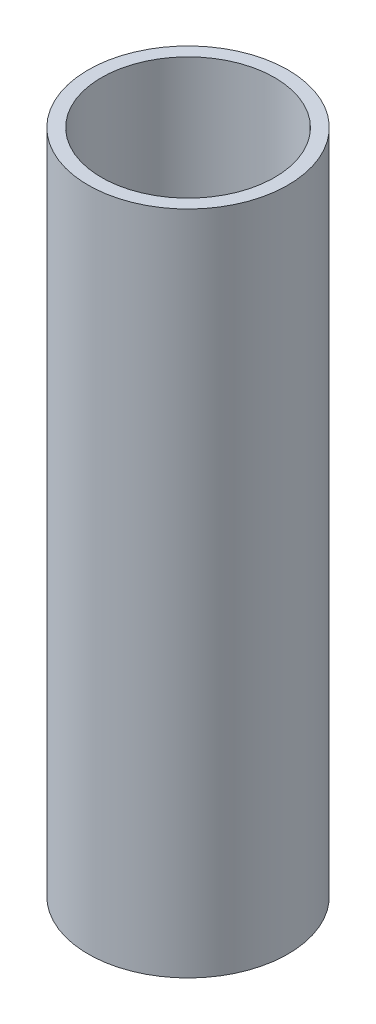
ISO-10303-21;
HEADER;
FILE_DESCRIPTION(('STEP AP214'),'2;1');
FILE_NAME('part.step','',(''),(''),'','','');
FILE_SCHEMA(('AUTOMOTIVE_DESIGN { 1 0 10303 214 1 1 1 1 }'));
ENDSEC;
DATA;
#1=APPLICATION_CONTEXT('core data for automotive mechanical design processes');
#2=APPLICATION_PROTOCOL_DEFINITION('international standard','automotive_design',2000,#1);
#3=PRODUCT_CONTEXT('',#1,'mechanical');
#4=PRODUCT('Part','Part','',(#3));
#5=PRODUCT_RELATED_PRODUCT_CATEGORY('part','',(#4));
#6=PRODUCT_DEFINITION_FORMATION('','',#4);
#7=PRODUCT_DEFINITION_CONTEXT('part definition',#1,'design');
#8=PRODUCT_DEFINITION('design','',#6,#7);
#9=PRODUCT_DEFINITION_SHAPE('','',#8);
#10=(LENGTH_UNIT() NAMED_UNIT(*) SI_UNIT(.MILLI.,.METRE.));
#11=(NAMED_UNIT(*) PLANE_ANGLE_UNIT() SI_UNIT($,.RADIAN.));
#12=(NAMED_UNIT(*) SI_UNIT($,.STERADIAN.) SOLID_ANGLE_UNIT());
#13=UNCERTAINTY_MEASURE_WITH_UNIT(LENGTH_MEASURE(1.E-05),#10,'distance_accuracy_value','');
#14=(GEOMETRIC_REPRESENTATION_CONTEXT(3) GLOBAL_UNCERTAINTY_ASSIGNED_CONTEXT((#13)) GLOBAL_UNIT_ASSIGNED_CONTEXT((#10,
#11,#12)) REPRESENTATION_CONTEXT('',''));
#15=CARTESIAN_POINT('',(0.,0.,0.));
#16=DIRECTION('',(0.,0.,1.));
#17=DIRECTION('',(1.,0.,0.));
#18=AXIS2_PLACEMENT_3D('',#15,#16,#17);
#19=CARTESIAN_POINT('',(0.,0.,0.));
#20=DIRECTION('',(0.,-1.,0.));
#21=DIRECTION('',(0.,0.,-1.));
#22=AXIS2_PLACEMENT_3D('',#19,#20,#21);
#23=PLANE('',#22);
#24=CARTESIAN_POINT('',(0.,0.,0.));
#25=DIRECTION('',(0.,1.,0.));
#26=DIRECTION('',(0.,0.,1.));
#27=AXIS2_PLACEMENT_3D('',#24,#25,#26);
#28=CIRCLE('',#27,13.);
#29=CARTESIAN_POINT('',(0.,0.,-13.));
#30=VERTEX_POINT('',#29);
#31=EDGE_CURVE('E167',#30,#30,#28,.T.);
#32=ORIENTED_EDGE('',*,*,#31,.T.);
#33=EDGE_LOOP('',(#32));
#34=FACE_BOUND('',#33,.T.);
#35=DIRECTION('',(-0.5,0.,-0.866025403784439));
#36=VECTOR('',#35,1.);
#37=CARTESIAN_POINT('',(5.77350269189626,0.,0.));
#38=LINE('',#37,#36);
#39=CARTESIAN_POINT('',(5.77350269189626,0.,0.));
#40=VERTEX_POINT('',#39);
#41=CARTESIAN_POINT('',(2.88675134594813,0.,-5.));
#42=VERTEX_POINT('',#41);
#43=EDGE_CURVE('E132',#40,#42,#38,.T.);
#44=ORIENTED_EDGE('',*,*,#43,.F.);
#45=DIRECTION('',(0.5,0.,-0.866025403784439));
#46=VECTOR('',#45,1.);
#47=CARTESIAN_POINT('',(2.88675134594813,0.,5.));
#48=LINE('',#47,#46);
#49=CARTESIAN_POINT('',(2.88675134594813,0.,5.));
#50=VERTEX_POINT('',#49);
#51=EDGE_CURVE('E148',#50,#40,#48,.T.);
#52=ORIENTED_EDGE('',*,*,#51,.F.);
#53=DIRECTION('',(1.,0.,0.));
#54=VECTOR('',#53,1.);
#55=CARTESIAN_POINT('',(-2.88675134594813,0.,5.));
#56=LINE('',#55,#54);
#57=CARTESIAN_POINT('',(-2.88675134594813,0.,5.));
#58=VERTEX_POINT('',#57);
#59=EDGE_CURVE('E55',#58,#50,#56,.T.);
#60=ORIENTED_EDGE('',*,*,#59,.F.);
#61=DIRECTION('',(0.5,0.,0.866025403784438));
#62=VECTOR('',#61,1.);
#63=CARTESIAN_POINT('',(-5.77350269189626,0.,0.));
#64=LINE('',#63,#62);
#65=CARTESIAN_POINT('',(-5.77350269189626,0.,0.));
#66=VERTEX_POINT('',#65);
#67=EDGE_CURVE('E105',#66,#58,#64,.T.);
#68=ORIENTED_EDGE('',*,*,#67,.F.);
#69=DIRECTION('',(-0.5,0.,0.866025403784439));
#70=VECTOR('',#69,1.);
#71=CARTESIAN_POINT('',(-2.88675134594813,0.,-5.));
#72=LINE('',#71,#70);
#73=CARTESIAN_POINT('',(-2.88675134594813,0.,-5.));
#74=VERTEX_POINT('',#73);
#75=EDGE_CURVE('E140',#74,#66,#72,.T.);
#76=ORIENTED_EDGE('',*,*,#75,.F.);
#77=DIRECTION('',(-1.,0.,0.));
#78=VECTOR('',#77,1.);
#79=CARTESIAN_POINT('',(2.88675134594813,0.,-5.));
#80=LINE('',#79,#78);
#81=EDGE_CURVE('E135',#42,#74,#80,.T.);
#82=ORIENTED_EDGE('',*,*,#81,.F.);
#83=EDGE_LOOP('',(#44,#52,#60,#68,#76,#82));
#84=FACE_BOUND('',#83,.T.);
#85=ADVANCED_FACE('F39',(#34,#84),#23,.F.);
#86=CARTESIAN_POINT('',(0.,90.,0.));
#87=DIRECTION('',(0.,1.,0.));
#88=DIRECTION('',(0.,0.,1.));
#89=AXIS2_PLACEMENT_3D('',#86,#87,#88);
#90=PLANE('',#89);
#91=CARTESIAN_POINT('',(0.,90.,0.));
#92=DIRECTION('',(0.,1.,0.));
#93=DIRECTION('',(0.,0.,1.));
#94=AXIS2_PLACEMENT_3D('',#91,#92,#93);
#95=CIRCLE('',#94,15.);
#96=CARTESIAN_POINT('',(0.,90.,-15.));
#97=VERTEX_POINT('',#96);
#98=EDGE_CURVE('E11',#97,#97,#95,.T.);
#99=ORIENTED_EDGE('',*,*,#98,.T.);
#100=EDGE_LOOP('',(#99));
#101=FACE_BOUND('',#100,.T.);
#102=CARTESIAN_POINT('',(0.,90.,0.));
#103=DIRECTION('',(0.,1.,0.));
#104=DIRECTION('',(0.,0.,1.));
#105=AXIS2_PLACEMENT_3D('',#102,#103,#104);
#106=CIRCLE('',#105,13.);
#107=CARTESIAN_POINT('',(0.,90.,-13.));
#108=VERTEX_POINT('',#107);
#109=EDGE_CURVE('E48',#108,#108,#106,.T.);
#110=ORIENTED_EDGE('',*,*,#109,.F.);
#111=EDGE_LOOP('',(#110));
#112=FACE_BOUND('',#111,.T.);
#113=ADVANCED_FACE('F188',(#101,#112),#90,.T.);
#114=CARTESIAN_POINT('',(0.,90.,0.));
#115=DIRECTION('',(0.,-1.,0.));
#116=DIRECTION('',(0.,0.,-1.));
#117=AXIS2_PLACEMENT_3D('',#114,#115,#116);
#118=CYLINDRICAL_SURFACE('',#117,15.);
#119=CARTESIAN_POINT('',(0.,-10.,0.));
#120=DIRECTION('',(0.,-1.,0.));
#121=DIRECTION('',(0.,0.,-1.));
#122=AXIS2_PLACEMENT_3D('',#119,#120,#121);
#123=CIRCLE('',#122,15.);
#124=CARTESIAN_POINT('',(0.,-9.99999999999999,-15.));
#125=VERTEX_POINT('',#124);
#126=EDGE_CURVE('E154',#125,#125,#123,.T.);
#127=CARTESIAN_POINT('',(0.,90.,-15.));
#128=CARTESIAN_POINT('',(0.,88.9583333333333,-15.));
#129=CARTESIAN_POINT('',(0.,87.9166666666667,-15.));
#130=CARTESIAN_POINT('',(0.,85.8333333333333,-15.));
#131=CARTESIAN_POINT('',(0.,84.7916666666667,-15.));
#132=CARTESIAN_POINT('',(0.,82.7083333333333,-15.));
#133=CARTESIAN_POINT('',(0.,81.6666666666667,-15.));
#134=CARTESIAN_POINT('',(0.,79.5833333333333,-15.));
#135=CARTESIAN_POINT('',(0.,78.5416666666666,-15.));
#136=CARTESIAN_POINT('',(0.,76.4583333333333,-15.));
#137=CARTESIAN_POINT('',(0.,75.4166666666667,-15.));
#138=CARTESIAN_POINT('',(0.,73.3333333333333,-15.));
#139=CARTESIAN_POINT('',(0.,72.2916666666667,-15.));
#140=CARTESIAN_POINT('',(0.,70.2083333333333,-15.));
#141=CARTESIAN_POINT('',(0.,69.1666666666667,-15.));
#142=CARTESIAN_POINT('',(0.,67.0833333333333,-15.));
#143=CARTESIAN_POINT('',(0.,66.0416666666667,-15.));
#144=CARTESIAN_POINT('',(0.,63.9583333333333,-15.));
#145=CARTESIAN_POINT('',(0.,62.9166666666667,-15.));
#146=CARTESIAN_POINT('',(0.,60.8333333333333,-15.));
#147=CARTESIAN_POINT('',(0.,59.7916666666667,-15.));
#148=CARTESIAN_POINT('',(0.,57.7083333333333,-15.));
#149=CARTESIAN_POINT('',(0.,56.6666666666667,-15.));
#150=CARTESIAN_POINT('',(0.,54.5833333333333,-15.));
#151=CARTESIAN_POINT('',(0.,53.5416666666667,-15.));
#152=CARTESIAN_POINT('',(0.,51.4583333333333,-15.));
#153=CARTESIAN_POINT('',(0.,50.4166666666667,-15.));
#154=CARTESIAN_POINT('',(0.,48.3333333333333,-15.));
#155=CARTESIAN_POINT('',(0.,47.2916666666667,-15.));
#156=CARTESIAN_POINT('',(0.,45.2083333333333,-15.));
#157=CARTESIAN_POINT('',(0.,44.1666666666667,-15.));
#158=CARTESIAN_POINT('',(0.,42.0833333333333,-15.));
#159=CARTESIAN_POINT('',(0.,41.0416666666667,-15.));
#160=CARTESIAN_POINT('',(0.,38.9583333333333,-15.));
#161=CARTESIAN_POINT('',(0.,37.9166666666667,-15.));
#162=CARTESIAN_POINT('',(0.,35.8333333333333,-15.));
#163=CARTESIAN_POINT('',(0.,34.7916666666667,-15.));
#164=CARTESIAN_POINT('',(0.,32.7083333333333,-15.));
#165=CARTESIAN_POINT('',(0.,31.6666666666667,-15.));
#166=CARTESIAN_POINT('',(0.,29.5833333333333,-15.));
#167=CARTESIAN_POINT('',(0.,28.5416666666667,-15.));
#168=CARTESIAN_POINT('',(0.,26.4583333333333,-15.));
#169=CARTESIAN_POINT('',(0.,25.4166666666667,-15.));
#170=CARTESIAN_POINT('',(0.,23.3333333333333,-15.));
#171=CARTESIAN_POINT('',(0.,22.2916666666667,-15.));
#172=CARTESIAN_POINT('',(0.,20.2083333333333,-15.));
#173=CARTESIAN_POINT('',(0.,19.1666666666667,-15.));
#174=CARTESIAN_POINT('',(0.,17.0833333333333,-15.));
#175=CARTESIAN_POINT('',(0.,16.0416666666667,-15.));
#176=CARTESIAN_POINT('',(0.,13.9583333333333,-15.));
#177=CARTESIAN_POINT('',(0.,12.9166666666667,-15.));
#178=CARTESIAN_POINT('',(0.,10.8333333333333,-15.));
#179=CARTESIAN_POINT('',(0.,9.79166666666667,-15.));
#180=CARTESIAN_POINT('',(0.,7.70833333333334,-15.));
#181=CARTESIAN_POINT('',(0.,6.66666666666667,-15.));
#182=CARTESIAN_POINT('',(0.,4.58333333333334,-15.));
#183=CARTESIAN_POINT('',(0.,3.54166666666667,-15.));
#184=CARTESIAN_POINT('',(0.,1.45833333333333,-15.));
#185=CARTESIAN_POINT('',(0.,0.416666666666667,-15.));
#186=CARTESIAN_POINT('',(0.,-1.66666666666666,-15.));
#187=CARTESIAN_POINT('',(0.,-2.70833333333333,-15.));
#188=CARTESIAN_POINT('',(0.,-4.79166666666666,-15.));
#189=CARTESIAN_POINT('',(0.,-5.83333333333333,-15.));
#190=CARTESIAN_POINT('',(0.,-7.91666666666666,-15.));
#191=CARTESIAN_POINT('',(0.,-8.95833333333333,-15.));
#192=CARTESIAN_POINT('',(0.,-9.99999999999999,-15.));
#193=B_SPLINE_CURVE_WITH_KNOTS('',3,(#127,#128,#129,#130,#131,#132,#133,#134,#135,#136,#137,
#138,#139,#140,#141,#142,#143,#144,#145,#146,#147,#148,#149,#150,#151,#152,#153,#154,#155,#156,
#157,#158,#159,#160,#161,#162,#163,#164,#165,#166,#167,#168,#169,#170,#171,#172,#173,#174,#175,
#176,#177,#178,#179,#180,#181,#182,#183,#184,#185,#186,#187,#188,#189,#190,#191,#192),
.UNSPECIFIED.,.F.,.F.,(4,2,2,2,2,2,2,2,2,2,2,2,2,2,2,2,2,2,2,2,2,2,2,2,2,2,2,2,2,2,2,2,4),(0.,
3.12499999999999,6.24999999999999,9.37499999999999,12.5,15.625,18.75,21.875,25.,28.125,31.25,
34.375,37.5,40.625,43.75,46.875,50.,53.125,56.25,59.375,62.5,65.625,68.75,71.875,75.,78.125,
81.25,84.375,87.5,90.625,93.75,96.875,100.),.UNSPECIFIED.);
#194=EDGE_CURVE('BSEAM41',#97,#125,#193,.T.);
#195=ORIENTED_EDGE('',*,*,#98,.F.);
#196=ORIENTED_EDGE('',*,*,#126,.F.);
#197=ORIENTED_EDGE('',*,*,#194,.T.);
#198=ORIENTED_EDGE('',*,*,#194,.F.);
#199=EDGE_LOOP('',(#195,#197,#196,#198));
#200=FACE_BOUND('',#199,.T.);
#201=ADVANCED_FACE('F41',(#200),#118,.T.);
#202=CARTESIAN_POINT('',(0.,90.,0.));
#203=DIRECTION('',(0.,-1.,0.));
#204=DIRECTION('',(0.,0.,-1.));
#205=AXIS2_PLACEMENT_3D('',#202,#203,#204);
#206=CYLINDRICAL_SURFACE('',#205,13.);
#207=CARTESIAN_POINT('',(0.,90.,-13.));
#208=CARTESIAN_POINT('',(0.,89.0625,-13.));
#209=CARTESIAN_POINT('',(0.,88.125,-13.));
#210=CARTESIAN_POINT('',(0.,86.25,-13.));
#211=CARTESIAN_POINT('',(0.,85.3125,-13.));
#212=CARTESIAN_POINT('',(0.,83.4375,-13.));
#213=CARTESIAN_POINT('',(0.,82.5,-13.));
#214=CARTESIAN_POINT('',(0.,80.625,-13.));
#215=CARTESIAN_POINT('',(0.,79.6875,-13.));
#216=CARTESIAN_POINT('',(0.,77.8125,-13.));
#217=CARTESIAN_POINT('',(0.,76.875,-13.));
#218=CARTESIAN_POINT('',(0.,75.,-13.));
#219=CARTESIAN_POINT('',(0.,74.0625,-13.));
#220=CARTESIAN_POINT('',(0.,72.1875,-13.));
#221=CARTESIAN_POINT('',(0.,71.25,-13.));
#222=CARTESIAN_POINT('',(0.,69.375,-13.));
#223=CARTESIAN_POINT('',(0.,68.4375,-13.));
#224=CARTESIAN_POINT('',(0.,66.5625,-13.));
#225=CARTESIAN_POINT('',(0.,65.625,-13.));
#226=CARTESIAN_POINT('',(0.,63.75,-13.));
#227=CARTESIAN_POINT('',(0.,62.8125,-13.));
#228=CARTESIAN_POINT('',(0.,60.9375,-13.));
#229=CARTESIAN_POINT('',(0.,60.,-13.));
#230=CARTESIAN_POINT('',(0.,58.125,-13.));
#231=CARTESIAN_POINT('',(0.,57.1875,-13.));
#232=CARTESIAN_POINT('',(0.,55.3125,-13.));
#233=CARTESIAN_POINT('',(0.,54.375,-13.));
#234=CARTESIAN_POINT('',(0.,52.5,-13.));
#235=CARTESIAN_POINT('',(0.,51.5625,-13.));
#236=CARTESIAN_POINT('',(0.,49.6875,-13.));
#237=CARTESIAN_POINT('',(0.,48.75,-13.));
#238=CARTESIAN_POINT('',(0.,46.875,-13.));
#239=CARTESIAN_POINT('',(0.,45.9375,-13.));
#240=CARTESIAN_POINT('',(0.,44.0625,-13.));
#241=CARTESIAN_POINT('',(0.,43.125,-13.));
#242=CARTESIAN_POINT('',(0.,41.25,-13.));
#243=CARTESIAN_POINT('',(0.,40.3125,-13.));
#244=CARTESIAN_POINT('',(0.,38.4375,-13.));
#245=CARTESIAN_POINT('',(0.,37.5,-13.));
#246=CARTESIAN_POINT('',(0.,35.625,-13.));
#247=CARTESIAN_POINT('',(0.,34.6875,-13.));
#248=CARTESIAN_POINT('',(0.,32.8125,-13.));
#249=CARTESIAN_POINT('',(0.,31.875,-13.));
#250=CARTESIAN_POINT('',(0.,30.,-13.));
#251=CARTESIAN_POINT('',(0.,29.0625,-13.));
#252=CARTESIAN_POINT('',(0.,27.1875,-13.));
#253=CARTESIAN_POINT('',(0.,26.25,-13.));
#254=CARTESIAN_POINT('',(0.,24.375,-13.));
#255=CARTESIAN_POINT('',(0.,23.4375,-13.));
#256=CARTESIAN_POINT('',(0.,21.5625,-13.));
#257=CARTESIAN_POINT('',(0.,20.625,-13.));
#258=CARTESIAN_POINT('',(0.,18.75,-13.));
#259=CARTESIAN_POINT('',(0.,17.8125,-13.));
#260=CARTESIAN_POINT('',(0.,15.9375,-13.));
#261=CARTESIAN_POINT('',(0.,15.,-13.));
#262=CARTESIAN_POINT('',(0.,13.125,-13.));
#263=CARTESIAN_POINT('',(0.,12.1875,-13.));
#264=CARTESIAN_POINT('',(0.,10.3125,-13.));
#265=CARTESIAN_POINT('',(0.,9.37499999999999,-13.));
#266=CARTESIAN_POINT('',(0.,7.49999999999999,-13.));
#267=CARTESIAN_POINT('',(0.,6.56249999999999,-13.));
#268=CARTESIAN_POINT('',(0.,4.68749999999999,-13.));
#269=CARTESIAN_POINT('',(0.,3.74999999999998,-13.));
#270=CARTESIAN_POINT('',(0.,1.87499999999998,-13.));
#271=CARTESIAN_POINT('',(0.,0.937499999999986,-13.));
#272=CARTESIAN_POINT('',(0.,0.,-13.));
#273=B_SPLINE_CURVE_WITH_KNOTS('',3,(#207,#208,#209,#210,#211,#212,#213,#214,#215,#216,#217,
#218,#219,#220,#221,#222,#223,#224,#225,#226,#227,#228,#229,#230,#231,#232,#233,#234,#235,#236,
#237,#238,#239,#240,#241,#242,#243,#244,#245,#246,#247,#248,#249,#250,#251,#252,#253,#254,#255,
#256,#257,#258,#259,#260,#261,#262,#263,#264,#265,#266,#267,#268,#269,#270,#271,#272),
.UNSPECIFIED.,.F.,.F.,(4,2,2,2,2,2,2,2,2,2,2,2,2,2,2,2,2,2,2,2,2,2,2,2,2,2,2,2,2,2,2,2,4),(0.,
2.8125,5.62499999999999,8.43749999999999,11.25,14.0625,16.875,19.6875,22.5,25.3125,28.125,
30.9375,33.75,36.5625,39.375,42.1875,45.,47.8125,50.625,53.4375,56.25,59.0625,61.875,64.6875,
67.5,70.3125,73.125,75.9375,78.75,81.5625,84.375,87.1875,90.),.UNSPECIFIED.);
#274=EDGE_CURVE('BSEAM176',#108,#30,#273,.T.);
#275=ORIENTED_EDGE('',*,*,#109,.T.);
#276=ORIENTED_EDGE('',*,*,#31,.F.);
#277=ORIENTED_EDGE('',*,*,#274,.T.);
#278=ORIENTED_EDGE('',*,*,#274,.F.);
#279=EDGE_LOOP('',(#275,#277,#276,#278));
#280=FACE_BOUND('',#279,.T.);
#281=ADVANCED_FACE('F176',(#280),#206,.F.);
#282=CARTESIAN_POINT('',(0.,-10.,0.));
#283=DIRECTION('',(0.,-1.,0.));
#284=DIRECTION('',(0.,0.,-1.));
#285=AXIS2_PLACEMENT_3D('',#282,#283,#284);
#286=PLANE('',#285);
#287=CARTESIAN_POINT('',(0.,-10.,0.));
#288=DIRECTION('',(0.,1.,0.));
#289=DIRECTION('',(0.,0.,1.));
#290=AXIS2_PLACEMENT_3D('',#287,#288,#289);
#291=CIRCLE('',#290,3.25);
#292=CARTESIAN_POINT('',(0.,-10.,3.25));
#293=VERTEX_POINT('',#292);
#294=EDGE_CURVE('E136',#293,#293,#291,.T.);
#295=ORIENTED_EDGE('',*,*,#294,.T.);
#296=EDGE_LOOP('',(#295));
#297=FACE_BOUND('',#296,.T.);
#298=ORIENTED_EDGE('',*,*,#126,.T.);
#299=EDGE_LOOP('',(#298));
#300=FACE_BOUND('',#299,.T.);
#301=ADVANCED_FACE('F178',(#297,#300),#286,.T.);
#302=CARTESIAN_POINT('',(5.77350269189626,-4.,0.));
#303=DIRECTION('',(0.866025403784439,0.,-0.5));
#304=DIRECTION('',(-0.5,0.,-0.866025403784439));
#305=AXIS2_PLACEMENT_3D('',#302,#303,#304);
#306=PLANE('',#305);
#307=ORIENTED_EDGE('',*,*,#43,.T.);
#308=DIRECTION('',(0.,1.,0.));
#309=VECTOR('',#308,1.);
#310=CARTESIAN_POINT('',(2.88675134594813,-4.,-5.));
#311=LINE('',#310,#309);
#312=CARTESIAN_POINT('',(2.88675134594813,-4.,-5.));
#313=VERTEX_POINT('',#312);
#314=EDGE_CURVE('E87',#313,#42,#311,.T.);
#315=ORIENTED_EDGE('',*,*,#314,.F.);
#316=DIRECTION('',(-0.5,0.,-0.866025403784439));
#317=VECTOR('',#316,1.);
#318=CARTESIAN_POINT('',(5.77350269189626,-4.,0.));
#319=LINE('',#318,#317);
#320=CARTESIAN_POINT('',(5.77350269189626,-4.,0.));
#321=VERTEX_POINT('',#320);
#322=EDGE_CURVE('E151',#321,#313,#319,.T.);
#323=ORIENTED_EDGE('',*,*,#322,.F.);
#324=DIRECTION('',(0.,1.,0.));
#325=VECTOR('',#324,1.);
#326=CARTESIAN_POINT('',(5.77350269189626,-4.,0.));
#327=LINE('',#326,#325);
#328=EDGE_CURVE('E64',#321,#40,#327,.T.);
#329=ORIENTED_EDGE('',*,*,#328,.T.);
#330=EDGE_LOOP('',(#307,#315,#323,#329));
#331=FACE_BOUND('',#330,.T.);
#332=ADVANCED_FACE('F185',(#331),#306,.F.);
#333=CARTESIAN_POINT('',(2.88675134594813,-4.,5.));
#334=DIRECTION('',(0.866025403784439,0.,0.5));
#335=DIRECTION('',(0.5,0.,-0.866025403784439));
#336=AXIS2_PLACEMENT_3D('',#333,#334,#335);
#337=PLANE('',#336);
#338=ORIENTED_EDGE('',*,*,#51,.T.);
#339=ORIENTED_EDGE('',*,*,#328,.F.);
#340=DIRECTION('',(0.5,0.,-0.866025403784439));
#341=VECTOR('',#340,1.);
#342=CARTESIAN_POINT('',(2.88675134594813,-4.,5.));
#343=LINE('',#342,#341);
#344=CARTESIAN_POINT('',(2.88675134594813,-4.,5.));
#345=VERTEX_POINT('',#344);
#346=EDGE_CURVE('E116',#345,#321,#343,.T.);
#347=ORIENTED_EDGE('',*,*,#346,.F.);
#348=DIRECTION('',(0.,1.,0.));
#349=VECTOR('',#348,1.);
#350=CARTESIAN_POINT('',(2.88675134594813,-4.,5.));
#351=LINE('',#350,#349);
#352=EDGE_CURVE('E107',#345,#50,#351,.T.);
#353=ORIENTED_EDGE('',*,*,#352,.T.);
#354=EDGE_LOOP('',(#338,#339,#347,#353));
#355=FACE_BOUND('',#354,.T.);
#356=ADVANCED_FACE('F199',(#355),#337,.F.);
#357=CARTESIAN_POINT('',(-2.88675134594813,-4.,5.));
#358=DIRECTION('',(0.,0.,1.));
#359=DIRECTION('',(1.,0.,0.));
#360=AXIS2_PLACEMENT_3D('',#357,#358,#359);
#361=PLANE('',#360);
#362=ORIENTED_EDGE('',*,*,#59,.T.);
#363=ORIENTED_EDGE('',*,*,#352,.F.);
#364=DIRECTION('',(1.,0.,0.));
#365=VECTOR('',#364,1.);
#366=CARTESIAN_POINT('',(-2.88675134594813,-4.,5.));
#367=LINE('',#366,#365);
#368=CARTESIAN_POINT('',(-2.88675134594813,-4.,5.));
#369=VERTEX_POINT('',#368);
#370=EDGE_CURVE('E111',#369,#345,#367,.T.);
#371=ORIENTED_EDGE('',*,*,#370,.F.);
#372=DIRECTION('',(0.,1.,0.));
#373=VECTOR('',#372,1.);
#374=CARTESIAN_POINT('',(-2.88675134594813,-4.,5.));
#375=LINE('',#374,#373);
#376=EDGE_CURVE('E98',#369,#58,#375,.T.);
#377=ORIENTED_EDGE('',*,*,#376,.T.);
#378=EDGE_LOOP('',(#362,#363,#371,#377));
#379=FACE_BOUND('',#378,.T.);
#380=ADVANCED_FACE('F112',(#379),#361,.F.);
#381=CARTESIAN_POINT('',(-5.77350269189626,-4.,0.));
#382=DIRECTION('',(-0.866025403784439,0.,0.5));
#383=DIRECTION('',(0.5,0.,0.866025403784438));
#384=AXIS2_PLACEMENT_3D('',#381,#382,#383);
#385=PLANE('',#384);
#386=ORIENTED_EDGE('',*,*,#67,.T.);
#387=ORIENTED_EDGE('',*,*,#376,.F.);
#388=DIRECTION('',(0.5,0.,0.866025403784438));
#389=VECTOR('',#388,1.);
#390=CARTESIAN_POINT('',(-5.77350269189626,-4.,0.));
#391=LINE('',#390,#389);
#392=CARTESIAN_POINT('',(-5.77350269189626,-4.,0.));
#393=VERTEX_POINT('',#392);
#394=EDGE_CURVE('E102',#393,#369,#391,.T.);
#395=ORIENTED_EDGE('',*,*,#394,.F.);
#396=DIRECTION('',(0.,1.,0.));
#397=VECTOR('',#396,1.);
#398=CARTESIAN_POINT('',(-5.77350269189626,-4.,0.));
#399=LINE('',#398,#397);
#400=EDGE_CURVE('E108',#393,#66,#399,.T.);
#401=ORIENTED_EDGE('',*,*,#400,.T.);
#402=EDGE_LOOP('',(#386,#387,#395,#401));
#403=FACE_BOUND('',#402,.T.);
#404=ADVANCED_FACE('F100',(#403),#385,.F.);
#405=CARTESIAN_POINT('',(-2.88675134594813,-4.,-5.));
#406=DIRECTION('',(-0.866025403784439,0.,-0.5));
#407=DIRECTION('',(-0.5,0.,0.866025403784439));
#408=AXIS2_PLACEMENT_3D('',#405,#406,#407);
#409=PLANE('',#408);
#410=ORIENTED_EDGE('',*,*,#75,.T.);
#411=ORIENTED_EDGE('',*,*,#400,.F.);
#412=DIRECTION('',(-0.5,0.,0.866025403784439));
#413=VECTOR('',#412,1.);
#414=CARTESIAN_POINT('',(-2.88675134594813,-4.,-5.));
#415=LINE('',#414,#413);
#416=CARTESIAN_POINT('',(-2.88675134594813,-4.,-5.));
#417=VERTEX_POINT('',#416);
#418=EDGE_CURVE('E122',#417,#393,#415,.T.);
#419=ORIENTED_EDGE('',*,*,#418,.F.);
#420=DIRECTION('',(0.,1.,0.));
#421=VECTOR('',#420,1.);
#422=CARTESIAN_POINT('',(-2.88675134594813,-4.,-5.));
#423=LINE('',#422,#421);
#424=EDGE_CURVE('E159',#417,#74,#423,.T.);
#425=ORIENTED_EDGE('',*,*,#424,.T.);
#426=EDGE_LOOP('',(#410,#411,#419,#425));
#427=FACE_BOUND('',#426,.T.);
#428=ADVANCED_FACE('F203',(#427),#409,.F.);
#429=CARTESIAN_POINT('',(2.88675134594813,-4.,-5.));
#430=DIRECTION('',(0.,0.,-1.));
#431=DIRECTION('',(-1.,0.,0.));
#432=AXIS2_PLACEMENT_3D('',#429,#430,#431);
#433=PLANE('',#432);
#434=ORIENTED_EDGE('',*,*,#81,.T.);
#435=ORIENTED_EDGE('',*,*,#424,.F.);
#436=DIRECTION('',(-1.,0.,0.));
#437=VECTOR('',#436,1.);
#438=CARTESIAN_POINT('',(2.88675134594813,-4.,-5.));
#439=LINE('',#438,#437);
#440=EDGE_CURVE('E126',#313,#417,#439,.T.);
#441=ORIENTED_EDGE('',*,*,#440,.F.);
#442=ORIENTED_EDGE('',*,*,#314,.T.);
#443=EDGE_LOOP('',(#434,#435,#441,#442));
#444=FACE_BOUND('',#443,.T.);
#445=ADVANCED_FACE('F200',(#444),#433,.F.);
#446=CARTESIAN_POINT('',(0.,-4.,0.));
#447=DIRECTION('',(0.,1.,0.));
#448=DIRECTION('',(0.,0.,1.));
#449=AXIS2_PLACEMENT_3D('',#446,#447,#448);
#450=PLANE('',#449);
#451=CARTESIAN_POINT('',(0.,-4.,0.));
#452=DIRECTION('',(0.,1.,0.));
#453=DIRECTION('',(0.,0.,1.));
#454=AXIS2_PLACEMENT_3D('',#451,#452,#453);
#455=CIRCLE('',#454,3.25);
#456=CARTESIAN_POINT('',(0.,-4.,3.25));
#457=VERTEX_POINT('',#456);
#458=EDGE_CURVE('E227',#457,#457,#455,.T.);
#459=ORIENTED_EDGE('',*,*,#458,.F.);
#460=EDGE_LOOP('',(#459));
#461=FACE_BOUND('',#460,.T.);
#462=ORIENTED_EDGE('',*,*,#322,.T.);
#463=ORIENTED_EDGE('',*,*,#440,.T.);
#464=ORIENTED_EDGE('',*,*,#418,.T.);
#465=ORIENTED_EDGE('',*,*,#394,.T.);
#466=ORIENTED_EDGE('',*,*,#370,.T.);
#467=ORIENTED_EDGE('',*,*,#346,.T.);
#468=EDGE_LOOP('',(#462,#463,#464,#465,#466,#467));
#469=FACE_BOUND('',#468,.T.);
#470=ADVANCED_FACE('F119',(#461,#469),#450,.T.);
#471=CARTESIAN_POINT('',(0.,-10.,0.));
#472=DIRECTION('',(0.,1.,0.));
#473=DIRECTION('',(0.,0.,1.));
#474=AXIS2_PLACEMENT_3D('',#471,#472,#473);
#475=CYLINDRICAL_SURFACE('',#474,3.25);
#476=ORIENTED_EDGE('',*,*,#294,.F.);
#477=EDGE_LOOP('',(#476));
#478=FACE_BOUND('',#477,.T.);
#479=ORIENTED_EDGE('',*,*,#458,.T.);
#480=EDGE_LOOP('',(#479));
#481=FACE_BOUND('',#480,.T.);
#482=ADVANCED_FACE('F216',(#478,#481),#475,.F.);
#483=CLOSED_SHELL('',(#85,#113,#201,#281,#301,#332,#356,#380,#404,#428,#445,#470,#482));
#484=MANIFOLD_SOLID_BREP('B2',#483);
#485=ADVANCED_BREP_SHAPE_REPRESENTATION('',(#18,#484),#14);
#486=SHAPE_DEFINITION_REPRESENTATION(#9,#485);
ENDSEC;
END-ISO-10303-21;
